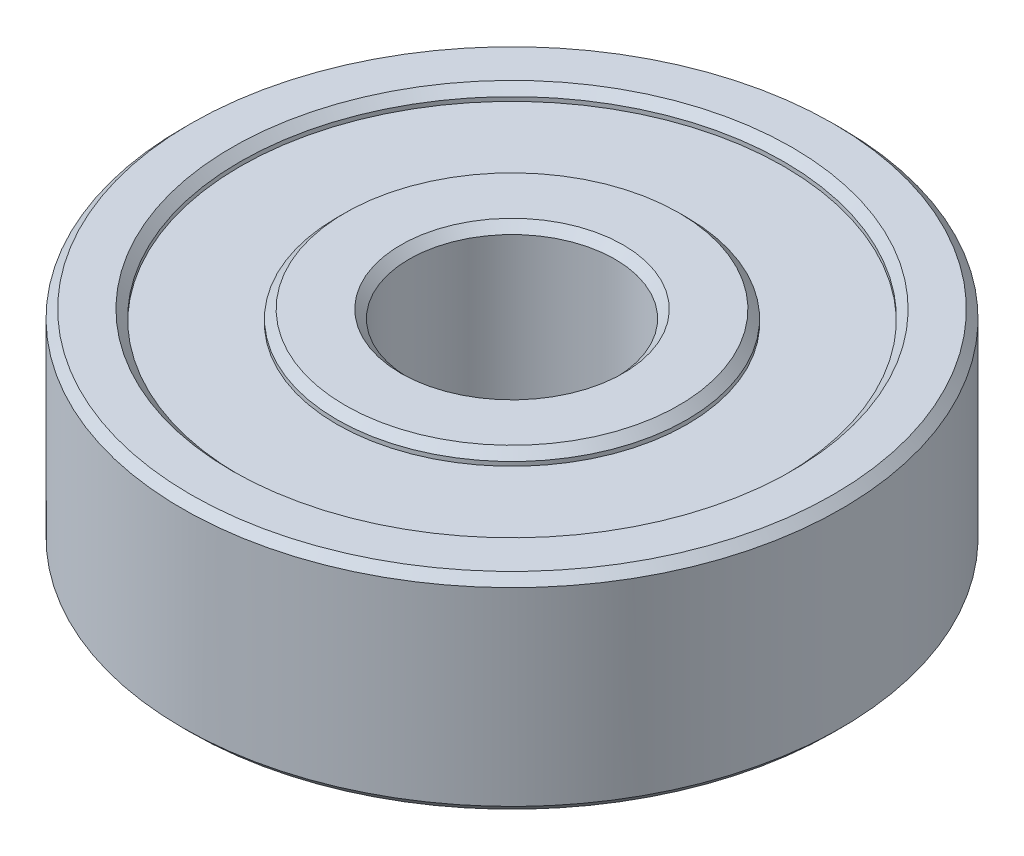
ISO-10303-21;
HEADER;
FILE_DESCRIPTION(('STEP AP214'),'2;1');
FILE_NAME('part.step','',(''),(''),'','','');
FILE_SCHEMA(('AUTOMOTIVE_DESIGN { 1 0 10303 214 1 1 1 1 }'));
ENDSEC;
DATA;
#1=APPLICATION_CONTEXT('core data for automotive mechanical design processes');
#2=APPLICATION_PROTOCOL_DEFINITION('international standard','automotive_design',2000,#1);
#3=PRODUCT_CONTEXT('',#1,'mechanical');
#4=PRODUCT('Part','Part','',(#3));
#5=PRODUCT_RELATED_PRODUCT_CATEGORY('part','',(#4));
#6=PRODUCT_DEFINITION_FORMATION('','',#4);
#7=PRODUCT_DEFINITION_CONTEXT('part definition',#1,'design');
#8=PRODUCT_DEFINITION('design','',#6,#7);
#9=PRODUCT_DEFINITION_SHAPE('','',#8);
#10=(LENGTH_UNIT() NAMED_UNIT(*) SI_UNIT(.MILLI.,.METRE.));
#11=(NAMED_UNIT(*) PLANE_ANGLE_UNIT() SI_UNIT($,.RADIAN.));
#12=(NAMED_UNIT(*) SI_UNIT($,.STERADIAN.) SOLID_ANGLE_UNIT());
#13=UNCERTAINTY_MEASURE_WITH_UNIT(LENGTH_MEASURE(1.E-05),#10,'distance_accuracy_value','');
#14=(GEOMETRIC_REPRESENTATION_CONTEXT(3) GLOBAL_UNCERTAINTY_ASSIGNED_CONTEXT((#13)) GLOBAL_UNIT_ASSIGNED_CONTEXT((#10,
#11,#12)) REPRESENTATION_CONTEXT('',''));
#15=CARTESIAN_POINT('',(0.,0.,0.));
#16=DIRECTION('',(0.,0.,1.));
#17=DIRECTION('',(1.,0.,0.));
#18=AXIS2_PLACEMENT_3D('',#15,#16,#17);
#19=CARTESIAN_POINT('',(0.,4.8,0.));
#20=DIRECTION('',(0.,1.,0.));
#21=DIRECTION('',(0.,0.,-1.));
#22=AXIS2_PLACEMENT_3D('',#19,#20,#21);
#23=CONICAL_SURFACE('',#22,2.5,0.785398163397448);
#24=CARTESIAN_POINT('',(0.,4.8,0.));
#25=DIRECTION('',(0.,1.,0.));
#26=DIRECTION('',(-1.,0.,0.));
#27=AXIS2_PLACEMENT_3D('',#24,#25,#26);
#28=CIRCLE('',#27,2.5);
#29=CARTESIAN_POINT('',(0.,4.8,2.5));
#30=VERTEX_POINT('',#29);
#31=EDGE_CURVE('E151',#30,#30,#28,.T.);
#32=ORIENTED_EDGE('',*,*,#31,.F.);
#33=DIRECTION('',(0.,0.707106781186548,0.707106781186547));
#34=VECTOR('',#33,1.);
#35=CARTESIAN_POINT('',(0.,4.8,2.5));
#36=LINE('',#35,#34);
#37=CARTESIAN_POINT('',(0.,5.,2.7));
#38=VERTEX_POINT('',#37);
#39=EDGE_CURVE('E11',#30,#38,#36,.T.);
#40=ORIENTED_EDGE('',*,*,#39,.T.);
#41=CARTESIAN_POINT('',(0.,5.,0.));
#42=DIRECTION('',(0.,-1.,0.));
#43=DIRECTION('',(0.,0.,-1.));
#44=AXIS2_PLACEMENT_3D('',#41,#42,#43);
#45=CIRCLE('',#44,2.7);
#46=EDGE_CURVE('E28',#38,#38,#45,.T.);
#47=ORIENTED_EDGE('',*,*,#46,.F.);
#48=ORIENTED_EDGE('',*,*,#39,.F.);
#49=EDGE_LOOP('',(#32,#40,#47,#48));
#50=FACE_BOUND('',#49,.T.);
#51=ADVANCED_FACE('F17',(#50),#23,.F.);
#52=CARTESIAN_POINT('',(-4.051,5.,-4.051));
#53=DIRECTION('',(0.,-1.,0.));
#54=DIRECTION('',(0.,0.,-1.));
#55=AXIS2_PLACEMENT_3D('',#52,#53,#54);
#56=PLANE('',#55);
#57=ORIENTED_EDGE('',*,*,#46,.T.);
#58=EDGE_LOOP('',(#57));
#59=FACE_BOUND('',#58,.T.);
#60=CARTESIAN_POINT('',(0.,5.,0.));
#61=DIRECTION('',(0.,-1.,0.));
#62=DIRECTION('',(0.,0.,1.));
#63=AXIS2_PLACEMENT_3D('',#60,#61,#62);
#64=CIRCLE('',#63,4.05);
#65=CARTESIAN_POINT('',(0.,5.,-4.05));
#66=VERTEX_POINT('',#65);
#67=EDGE_CURVE('E169',#66,#66,#64,.T.);
#68=ORIENTED_EDGE('',*,*,#67,.F.);
#69=EDGE_LOOP('',(#68));
#70=FACE_BOUND('',#69,.T.);
#71=ADVANCED_FACE('F569',(#59,#70),#56,.F.);
#72=CARTESIAN_POINT('',(0.,0.2,0.));
#73=DIRECTION('',(0.,-1.,0.));
#74=DIRECTION('',(0.,0.,-1.));
#75=AXIS2_PLACEMENT_3D('',#72,#73,#74);
#76=CYLINDRICAL_SURFACE('',#75,2.5);
#77=CARTESIAN_POINT('',(0.,0.2,0.));
#78=DIRECTION('',(0.,1.,0.));
#79=DIRECTION('',(-1.,0.,0.));
#80=AXIS2_PLACEMENT_3D('',#77,#78,#79);
#81=CIRCLE('',#80,2.5);
#82=CARTESIAN_POINT('',(0.,0.2,-2.5));
#83=VERTEX_POINT('',#82);
#84=CARTESIAN_POINT('',(0.,0.2,2.5));
#85=VERTEX_POINT('',#84);
#86=EDGE_CURVE('E21',#83,#85,#81,.T.);
#87=ORIENTED_EDGE('',*,*,#86,.F.);
#88=CARTESIAN_POINT('',(0.,0.2,0.));
#89=DIRECTION('',(0.,1.,0.));
#90=DIRECTION('',(-1.,0.,0.));
#91=AXIS2_PLACEMENT_3D('',#88,#89,#90);
#92=CIRCLE('',#91,2.5);
#93=EDGE_CURVE('E190',#85,#83,#92,.T.);
#94=ORIENTED_EDGE('',*,*,#93,.F.);
#95=DIRECTION('',(0.,1.,0.));
#96=VECTOR('',#95,1.);
#97=CARTESIAN_POINT('',(0.,0.2,2.5));
#98=LINE('',#97,#96);
#99=EDGE_CURVE('E154',#85,#30,#98,.T.);
#100=ORIENTED_EDGE('',*,*,#99,.T.);
#101=ORIENTED_EDGE('',*,*,#31,.T.);
#102=ORIENTED_EDGE('',*,*,#99,.F.);
#103=EDGE_LOOP('',(#87,#94,#100,#101,#102));
#104=FACE_BOUND('',#103,.T.);
#105=ADVANCED_FACE('F263',(#104),#76,.F.);
#106=CARTESIAN_POINT('',(0.,4.8,0.));
#107=DIRECTION('',(0.,-1.,0.));
#108=DIRECTION('',(0.,0.,1.));
#109=AXIS2_PLACEMENT_3D('',#106,#107,#108);
#110=CONICAL_SURFACE('',#109,4.25,0.785398163397448);
#111=CARTESIAN_POINT('',(0.,4.8,0.));
#112=DIRECTION('',(0.,-1.,0.));
#113=DIRECTION('',(-1.,0.,0.));
#114=AXIS2_PLACEMENT_3D('',#111,#112,#113);
#115=CIRCLE('',#114,4.25);
#116=CARTESIAN_POINT('',(0.,4.8,-4.25));
#117=VERTEX_POINT('',#116);
#118=EDGE_CURVE('E195',#117,#117,#115,.T.);
#119=ORIENTED_EDGE('',*,*,#118,.F.);
#120=DIRECTION('',(0.,0.707106781186548,0.707106781186548));
#121=VECTOR('',#120,1.);
#122=CARTESIAN_POINT('',(0.,4.8,-4.25));
#123=LINE('',#122,#121);
#124=EDGE_CURVE('E202',#117,#66,#123,.T.);
#125=ORIENTED_EDGE('',*,*,#124,.T.);
#126=ORIENTED_EDGE('',*,*,#67,.T.);
#127=ORIENTED_EDGE('',*,*,#124,.F.);
#128=EDGE_LOOP('',(#119,#125,#126,#127));
#129=FACE_BOUND('',#128,.T.);
#130=ADVANCED_FACE('F551',(#129),#110,.T.);
#131=CARTESIAN_POINT('',(0.,0.2,0.));
#132=DIRECTION('',(0.,-1.,0.));
#133=DIRECTION('',(0.,0.,1.));
#134=AXIS2_PLACEMENT_3D('',#131,#132,#133);
#135=CONICAL_SURFACE('',#134,2.5,0.785398163397448);
#136=ORIENTED_EDGE('',*,*,#86,.T.);
#137=ORIENTED_EDGE('',*,*,#93,.T.);
#138=DIRECTION('',(0.,-0.707106781186548,-0.707106781186548));
#139=VECTOR('',#138,1.);
#140=CARTESIAN_POINT('',(0.,0.2,-2.5));
#141=LINE('',#140,#139);
#142=CARTESIAN_POINT('',(0.,0.,-2.7));
#143=VERTEX_POINT('',#142);
#144=EDGE_CURVE('E194',#83,#143,#141,.T.);
#145=ORIENTED_EDGE('',*,*,#144,.T.);
#146=CARTESIAN_POINT('',(0.,0.,0.));
#147=DIRECTION('',(0.,1.,0.));
#148=DIRECTION('',(0.,0.,1.));
#149=AXIS2_PLACEMENT_3D('',#146,#147,#148);
#150=CIRCLE('',#149,2.7);
#151=EDGE_CURVE('E243',#143,#143,#150,.T.);
#152=ORIENTED_EDGE('',*,*,#151,.F.);
#153=ORIENTED_EDGE('',*,*,#144,.F.);
#154=EDGE_LOOP('',(#136,#137,#145,#152,#153));
#155=FACE_BOUND('',#154,.T.);
#156=ADVANCED_FACE('F259',(#155),#135,.F.);
#157=CARTESIAN_POINT('',(0.,4.8,0.));
#158=DIRECTION('',(0.,1.,0.));
#159=DIRECTION('',(0.,0.,1.));
#160=AXIS2_PLACEMENT_3D('',#157,#158,#159);
#161=CYLINDRICAL_SURFACE('',#160,4.25);
#162=CARTESIAN_POINT('',(0.,4.7,0.));
#163=DIRECTION('',(0.,-1.,0.));
#164=DIRECTION('',(0.,0.,1.));
#165=AXIS2_PLACEMENT_3D('',#162,#163,#164);
#166=CIRCLE('',#165,4.25);
#167=CARTESIAN_POINT('',(0.,4.7,-4.25));
#168=VERTEX_POINT('',#167);
#169=EDGE_CURVE('E174',#168,#168,#166,.T.);
#170=ORIENTED_EDGE('',*,*,#169,.F.);
#171=DIRECTION('',(0.,1.,0.));
#172=VECTOR('',#171,1.);
#173=CARTESIAN_POINT('',(0.,4.8,-4.25));
#174=LINE('',#173,#172);
#175=EDGE_CURVE('E198',#168,#117,#174,.T.);
#176=ORIENTED_EDGE('',*,*,#175,.T.);
#177=ORIENTED_EDGE('',*,*,#118,.T.);
#178=ORIENTED_EDGE('',*,*,#175,.F.);
#179=EDGE_LOOP('',(#170,#176,#177,#178));
#180=FACE_BOUND('',#179,.T.);
#181=ADVANCED_FACE('F533',(#180),#161,.T.);
#182=CARTESIAN_POINT('',(4.051,0.,-4.051));
#183=DIRECTION('',(0.,1.,0.));
#184=DIRECTION('',(1.,0.,0.));
#185=AXIS2_PLACEMENT_3D('',#182,#183,#184);
#186=PLANE('',#185);
#187=ORIENTED_EDGE('',*,*,#151,.T.);
#188=EDGE_LOOP('',(#187));
#189=FACE_BOUND('',#188,.T.);
#190=CARTESIAN_POINT('',(0.,0.,0.));
#191=DIRECTION('',(0.,1.,0.));
#192=DIRECTION('',(0.,0.,-1.));
#193=AXIS2_PLACEMENT_3D('',#190,#191,#192);
#194=CIRCLE('',#193,4.05);
#195=CARTESIAN_POINT('',(0.,0.,4.05));
#196=VERTEX_POINT('',#195);
#197=EDGE_CURVE('E170',#196,#196,#194,.T.);
#198=ORIENTED_EDGE('',*,*,#197,.F.);
#199=EDGE_LOOP('',(#198));
#200=FACE_BOUND('',#199,.T.);
#201=ADVANCED_FACE('F255',(#189,#200),#186,.F.);
#202=CARTESIAN_POINT('',(-6.601,4.7,-6.601));
#203=DIRECTION('',(0.,-1.,0.));
#204=DIRECTION('',(0.,0.,-1.));
#205=AXIS2_PLACEMENT_3D('',#202,#203,#204);
#206=PLANE('',#205);
#207=ORIENTED_EDGE('',*,*,#169,.T.);
#208=EDGE_LOOP('',(#207));
#209=FACE_BOUND('',#208,.T.);
#210=CARTESIAN_POINT('',(0.,4.7,0.));
#211=DIRECTION('',(0.,-1.,0.));
#212=DIRECTION('',(0.,0.,-1.));
#213=AXIS2_PLACEMENT_3D('',#210,#211,#212);
#214=CIRCLE('',#213,6.6);
#215=CARTESIAN_POINT('',(0.,4.7,6.6));
#216=VERTEX_POINT('',#215);
#217=EDGE_CURVE('E179',#216,#216,#214,.T.);
#218=ORIENTED_EDGE('',*,*,#217,.F.);
#219=EDGE_LOOP('',(#218));
#220=FACE_BOUND('',#219,.T.);
#221=ADVANCED_FACE('F19',(#209,#220),#206,.F.);
#222=CARTESIAN_POINT('',(0.,0.2,0.));
#223=DIRECTION('',(0.,1.,0.));
#224=DIRECTION('',(0.,0.,-1.));
#225=AXIS2_PLACEMENT_3D('',#222,#223,#224);
#226=CONICAL_SURFACE('',#225,4.25,0.78539816339745);
#227=CARTESIAN_POINT('',(0.,0.2,0.));
#228=DIRECTION('',(0.,1.,0.));
#229=DIRECTION('',(-1.,0.,0.));
#230=AXIS2_PLACEMENT_3D('',#227,#228,#229);
#231=CIRCLE('',#230,4.25);
#232=CARTESIAN_POINT('',(0.,0.2,-4.25));
#233=VERTEX_POINT('',#232);
#234=CARTESIAN_POINT('',(0.,0.2,4.25));
#235=VERTEX_POINT('',#234);
#236=EDGE_CURVE('E185',#233,#235,#231,.T.);
#237=ORIENTED_EDGE('',*,*,#236,.F.);
#238=CARTESIAN_POINT('',(0.,0.2,0.));
#239=DIRECTION('',(0.,1.,0.));
#240=DIRECTION('',(-1.,0.,0.));
#241=AXIS2_PLACEMENT_3D('',#238,#239,#240);
#242=CIRCLE('',#241,4.25);
#243=EDGE_CURVE('E189',#235,#233,#242,.T.);
#244=ORIENTED_EDGE('',*,*,#243,.F.);
#245=DIRECTION('',(0.,-0.707106781186547,-0.707106781186549));
#246=VECTOR('',#245,1.);
#247=CARTESIAN_POINT('',(0.,0.2,4.25));
#248=LINE('',#247,#246);
#249=EDGE_CURVE('E175',#235,#196,#248,.T.);
#250=ORIENTED_EDGE('',*,*,#249,.T.);
#251=ORIENTED_EDGE('',*,*,#197,.T.);
#252=ORIENTED_EDGE('',*,*,#249,.F.);
#253=EDGE_LOOP('',(#237,#244,#250,#251,#252));
#254=FACE_BOUND('',#253,.T.);
#255=ADVANCED_FACE('F504',(#254),#226,.T.);
#256=CARTESIAN_POINT('',(0.,4.7,0.));
#257=DIRECTION('',(0.,-1.,0.));
#258=DIRECTION('',(0.,0.,-1.));
#259=AXIS2_PLACEMENT_3D('',#256,#257,#258);
#260=CYLINDRICAL_SURFACE('',#259,6.6);
#261=ORIENTED_EDGE('',*,*,#217,.T.);
#262=DIRECTION('',(0.,1.,0.));
#263=VECTOR('',#262,1.);
#264=CARTESIAN_POINT('',(0.,4.7,6.6));
#265=LINE('',#264,#263);
#266=CARTESIAN_POINT('',(0.,4.8,6.6));
#267=VERTEX_POINT('',#266);
#268=EDGE_CURVE('E183',#216,#267,#265,.T.);
#269=ORIENTED_EDGE('',*,*,#268,.T.);
#270=CARTESIAN_POINT('',(0.,4.8,0.));
#271=DIRECTION('',(0.,-1.,0.));
#272=DIRECTION('',(-1.,0.,0.));
#273=AXIS2_PLACEMENT_3D('',#270,#271,#272);
#274=CIRCLE('',#273,6.6);
#275=EDGE_CURVE('E156',#267,#267,#274,.T.);
#276=ORIENTED_EDGE('',*,*,#275,.F.);
#277=ORIENTED_EDGE('',*,*,#268,.F.);
#278=EDGE_LOOP('',(#261,#269,#276,#277));
#279=FACE_BOUND('',#278,.T.);
#280=ADVANCED_FACE('F493',(#279),#260,.F.);
#281=CARTESIAN_POINT('',(0.,0.3,0.));
#282=DIRECTION('',(0.,1.,0.));
#283=DIRECTION('',(0.,0.,1.));
#284=AXIS2_PLACEMENT_3D('',#281,#282,#283);
#285=CYLINDRICAL_SURFACE('',#284,4.25);
#286=ORIENTED_EDGE('',*,*,#236,.T.);
#287=ORIENTED_EDGE('',*,*,#243,.T.);
#288=DIRECTION('',(0.,1.,0.));
#289=VECTOR('',#288,1.);
#290=CARTESIAN_POINT('',(0.,0.3,-4.25));
#291=LINE('',#290,#289);
#292=CARTESIAN_POINT('',(0.,0.3,-4.25));
#293=VERTEX_POINT('',#292);
#294=EDGE_CURVE('E184',#233,#293,#291,.T.);
#295=ORIENTED_EDGE('',*,*,#294,.T.);
#296=CARTESIAN_POINT('',(0.,0.3,0.));
#297=DIRECTION('',(0.,1.,0.));
#298=DIRECTION('',(0.,0.,1.));
#299=AXIS2_PLACEMENT_3D('',#296,#297,#298);
#300=CIRCLE('',#299,4.25);
#301=EDGE_CURVE('E149',#293,#293,#300,.T.);
#302=ORIENTED_EDGE('',*,*,#301,.F.);
#303=ORIENTED_EDGE('',*,*,#294,.F.);
#304=EDGE_LOOP('',(#286,#287,#295,#302,#303));
#305=FACE_BOUND('',#304,.T.);
#306=ADVANCED_FACE('F482',(#305),#285,.T.);
#307=CARTESIAN_POINT('',(0.,4.8,0.));
#308=DIRECTION('',(0.,1.,0.));
#309=DIRECTION('',(0.,0.,-1.));
#310=AXIS2_PLACEMENT_3D('',#307,#308,#309);
#311=CONICAL_SURFACE('',#310,6.6,0.785398163397446);
#312=ORIENTED_EDGE('',*,*,#275,.T.);
#313=DIRECTION('',(0.,0.707106781186549,0.707106781186546));
#314=VECTOR('',#313,1.);
#315=CARTESIAN_POINT('',(0.,4.8,6.6));
#316=LINE('',#315,#314);
#317=CARTESIAN_POINT('',(0.,5.,6.8));
#318=VERTEX_POINT('',#317);
#319=EDGE_CURVE('E160',#267,#318,#316,.T.);
#320=ORIENTED_EDGE('',*,*,#319,.T.);
#321=CARTESIAN_POINT('',(0.,5.,0.));
#322=DIRECTION('',(0.,-1.,0.));
#323=DIRECTION('',(0.,0.,-1.));
#324=AXIS2_PLACEMENT_3D('',#321,#322,#323);
#325=CIRCLE('',#324,6.8);
#326=EDGE_CURVE('E145',#318,#318,#325,.T.);
#327=ORIENTED_EDGE('',*,*,#326,.F.);
#328=ORIENTED_EDGE('',*,*,#319,.F.);
#329=EDGE_LOOP('',(#312,#320,#327,#328));
#330=FACE_BOUND('',#329,.T.);
#331=ADVANCED_FACE('F472',(#330),#311,.F.);
#332=CARTESIAN_POINT('',(6.601,0.3,-6.601));
#333=DIRECTION('',(0.,1.,0.));
#334=DIRECTION('',(1.,0.,0.));
#335=AXIS2_PLACEMENT_3D('',#332,#333,#334);
#336=PLANE('',#335);
#337=ORIENTED_EDGE('',*,*,#301,.T.);
#338=EDGE_LOOP('',(#337));
#339=FACE_BOUND('',#338,.T.);
#340=CARTESIAN_POINT('',(0.,0.3,0.));
#341=DIRECTION('',(0.,1.,0.));
#342=DIRECTION('',(0.,0.,-1.));
#343=AXIS2_PLACEMENT_3D('',#340,#341,#342);
#344=CIRCLE('',#343,6.6);
#345=CARTESIAN_POINT('',(0.,0.3,6.6));
#346=VERTEX_POINT('',#345);
#347=EDGE_CURVE('E150',#346,#346,#344,.T.);
#348=ORIENTED_EDGE('',*,*,#347,.F.);
#349=EDGE_LOOP('',(#348));
#350=FACE_BOUND('',#349,.T.);
#351=ADVANCED_FACE('F462',(#339,#350),#336,.F.);
#352=CARTESIAN_POINT('',(-7.801,5.,-7.801));
#353=DIRECTION('',(0.,-1.,0.));
#354=DIRECTION('',(0.,0.,-1.));
#355=AXIS2_PLACEMENT_3D('',#352,#353,#354);
#356=PLANE('',#355);
#357=ORIENTED_EDGE('',*,*,#326,.T.);
#358=EDGE_LOOP('',(#357));
#359=FACE_BOUND('',#358,.T.);
#360=CARTESIAN_POINT('',(0.,5.,0.));
#361=DIRECTION('',(0.,-1.,0.));
#362=DIRECTION('',(0.,0.,1.));
#363=AXIS2_PLACEMENT_3D('',#360,#361,#362);
#364=CIRCLE('',#363,7.8);
#365=CARTESIAN_POINT('',(0.,5.,-7.8));
#366=VERTEX_POINT('',#365);
#367=EDGE_CURVE('E218',#366,#366,#364,.T.);
#368=ORIENTED_EDGE('',*,*,#367,.F.);
#369=EDGE_LOOP('',(#368));
#370=FACE_BOUND('',#369,.T.);
#371=ADVANCED_FACE('F451',(#359,#370),#356,.F.);
#372=CARTESIAN_POINT('',(0.,0.2,0.));
#373=DIRECTION('',(0.,-1.,0.));
#374=DIRECTION('',(0.,0.,-1.));
#375=AXIS2_PLACEMENT_3D('',#372,#373,#374);
#376=CYLINDRICAL_SURFACE('',#375,6.6);
#377=CARTESIAN_POINT('',(0.,0.2,0.));
#378=DIRECTION('',(0.,1.,0.));
#379=DIRECTION('',(-1.,0.,0.));
#380=AXIS2_PLACEMENT_3D('',#377,#378,#379);
#381=CIRCLE('',#380,6.6);
#382=CARTESIAN_POINT('',(0.,0.2,-6.6));
#383=VERTEX_POINT('',#382);
#384=CARTESIAN_POINT('',(0.,0.2,6.6));
#385=VERTEX_POINT('',#384);
#386=EDGE_CURVE('E143',#383,#385,#381,.T.);
#387=ORIENTED_EDGE('',*,*,#386,.F.);
#388=CARTESIAN_POINT('',(0.,0.2,0.));
#389=DIRECTION('',(0.,1.,0.));
#390=DIRECTION('',(-1.,0.,0.));
#391=AXIS2_PLACEMENT_3D('',#388,#389,#390);
#392=CIRCLE('',#391,6.6);
#393=EDGE_CURVE('E161',#385,#383,#392,.T.);
#394=ORIENTED_EDGE('',*,*,#393,.F.);
#395=DIRECTION('',(0.,1.,0.));
#396=VECTOR('',#395,1.);
#397=CARTESIAN_POINT('',(0.,0.2,6.6));
#398=LINE('',#397,#396);
#399=EDGE_CURVE('E205',#385,#346,#398,.T.);
#400=ORIENTED_EDGE('',*,*,#399,.T.);
#401=ORIENTED_EDGE('',*,*,#347,.T.);
#402=ORIENTED_EDGE('',*,*,#399,.F.);
#403=EDGE_LOOP('',(#387,#394,#400,#401,#402));
#404=FACE_BOUND('',#403,.T.);
#405=ADVANCED_FACE('F439',(#404),#376,.F.);
#406=CARTESIAN_POINT('',(0.,4.8,0.));
#407=DIRECTION('',(0.,-1.,0.));
#408=DIRECTION('',(0.,0.,1.));
#409=AXIS2_PLACEMENT_3D('',#406,#407,#408);
#410=CONICAL_SURFACE('',#409,8.,0.785398163397448);
#411=CARTESIAN_POINT('',(0.,4.8,0.));
#412=DIRECTION('',(0.,-1.,0.));
#413=DIRECTION('',(-1.,0.,0.));
#414=AXIS2_PLACEMENT_3D('',#411,#412,#413);
#415=CIRCLE('',#414,8.);
#416=CARTESIAN_POINT('',(0.,4.8,-8.));
#417=VERTEX_POINT('',#416);
#418=EDGE_CURVE('E176',#417,#417,#415,.T.);
#419=ORIENTED_EDGE('',*,*,#418,.F.);
#420=DIRECTION('',(0.,0.707106781186548,0.707106781186548));
#421=VECTOR('',#420,1.);
#422=CARTESIAN_POINT('',(0.,4.8,-8.));
#423=LINE('',#422,#421);
#424=EDGE_CURVE('E221',#417,#366,#423,.T.);
#425=ORIENTED_EDGE('',*,*,#424,.T.);
#426=ORIENTED_EDGE('',*,*,#367,.T.);
#427=ORIENTED_EDGE('',*,*,#424,.F.);
#428=EDGE_LOOP('',(#419,#425,#426,#427));
#429=FACE_BOUND('',#428,.T.);
#430=ADVANCED_FACE('F426',(#429),#410,.T.);
#431=CARTESIAN_POINT('',(0.,0.2,0.));
#432=DIRECTION('',(0.,-1.,0.));
#433=DIRECTION('',(0.,0.,1.));
#434=AXIS2_PLACEMENT_3D('',#431,#432,#433);
#435=CONICAL_SURFACE('',#434,6.6,0.785398163397448);
#436=ORIENTED_EDGE('',*,*,#386,.T.);
#437=ORIENTED_EDGE('',*,*,#393,.T.);
#438=DIRECTION('',(0.,-0.707106781186548,-0.707106781186547));
#439=VECTOR('',#438,1.);
#440=CARTESIAN_POINT('',(0.,0.2,-6.6));
#441=LINE('',#440,#439);
#442=CARTESIAN_POINT('',(0.,0.,-6.8));
#443=VERTEX_POINT('',#442);
#444=EDGE_CURVE('E165',#383,#443,#441,.T.);
#445=ORIENTED_EDGE('',*,*,#444,.T.);
#446=CARTESIAN_POINT('',(0.,0.,0.));
#447=DIRECTION('',(0.,1.,0.));
#448=DIRECTION('',(0.,0.,1.));
#449=AXIS2_PLACEMENT_3D('',#446,#447,#448);
#450=CIRCLE('',#449,6.8);
#451=EDGE_CURVE('E227',#443,#443,#450,.T.);
#452=ORIENTED_EDGE('',*,*,#451,.F.);
#453=ORIENTED_EDGE('',*,*,#444,.F.);
#454=EDGE_LOOP('',(#436,#437,#445,#452,#453));
#455=FACE_BOUND('',#454,.T.);
#456=ADVANCED_FACE('F415',(#455),#435,.F.);
#457=CARTESIAN_POINT('',(0.,4.8,0.));
#458=DIRECTION('',(0.,1.,0.));
#459=DIRECTION('',(0.,0.,1.));
#460=AXIS2_PLACEMENT_3D('',#457,#458,#459);
#461=CYLINDRICAL_SURFACE('',#460,8.);
#462=CARTESIAN_POINT('',(0.,0.2,0.));
#463=DIRECTION('',(0.,-1.,0.));
#464=DIRECTION('',(-1.,0.,0.));
#465=AXIS2_PLACEMENT_3D('',#462,#463,#464);
#466=CIRCLE('',#465,8.);
#467=CARTESIAN_POINT('',(0.,0.2,8.));
#468=VERTEX_POINT('',#467);
#469=CARTESIAN_POINT('',(0.,0.2,-8.));
#470=VERTEX_POINT('',#469);
#471=EDGE_CURVE('E122',#468,#470,#466,.T.);
#472=ORIENTED_EDGE('',*,*,#471,.F.);
#473=CARTESIAN_POINT('',(0.,0.2,0.));
#474=DIRECTION('',(0.,-1.,0.));
#475=DIRECTION('',(-1.,0.,0.));
#476=AXIS2_PLACEMENT_3D('',#473,#474,#475);
#477=CIRCLE('',#476,8.);
#478=EDGE_CURVE('E126',#470,#468,#477,.T.);
#479=ORIENTED_EDGE('',*,*,#478,.F.);
#480=DIRECTION('',(0.,1.,0.));
#481=VECTOR('',#480,1.);
#482=CARTESIAN_POINT('',(0.,4.8,-8.));
#483=LINE('',#482,#481);
#484=EDGE_CURVE('E135',#470,#417,#483,.T.);
#485=ORIENTED_EDGE('',*,*,#484,.T.);
#486=ORIENTED_EDGE('',*,*,#418,.T.);
#487=ORIENTED_EDGE('',*,*,#484,.F.);
#488=EDGE_LOOP('',(#472,#479,#485,#486,#487));
#489=FACE_BOUND('',#488,.T.);
#490=ADVANCED_FACE('F133',(#489),#461,.T.);
#491=CARTESIAN_POINT('',(7.801,0.,-7.801));
#492=DIRECTION('',(0.,1.,0.));
#493=DIRECTION('',(1.,0.,0.));
#494=AXIS2_PLACEMENT_3D('',#491,#492,#493);
#495=PLANE('',#494);
#496=ORIENTED_EDGE('',*,*,#451,.T.);
#497=EDGE_LOOP('',(#496));
#498=FACE_BOUND('',#497,.T.);
#499=CARTESIAN_POINT('',(0.,0.,0.));
#500=DIRECTION('',(0.,1.,0.));
#501=DIRECTION('',(0.,0.,-1.));
#502=AXIS2_PLACEMENT_3D('',#499,#500,#501);
#503=CIRCLE('',#502,7.8);
#504=CARTESIAN_POINT('',(0.,0.,7.8));
#505=VERTEX_POINT('',#504);
#506=EDGE_CURVE('E124',#505,#505,#503,.T.);
#507=ORIENTED_EDGE('',*,*,#506,.F.);
#508=EDGE_LOOP('',(#507));
#509=FACE_BOUND('',#508,.T.);
#510=ADVANCED_FACE('F390',(#498,#509),#495,.F.);
#511=CARTESIAN_POINT('',(0.,0.2,0.));
#512=DIRECTION('',(0.,1.,0.));
#513=DIRECTION('',(0.,0.,-1.));
#514=AXIS2_PLACEMENT_3D('',#511,#512,#513);
#515=CONICAL_SURFACE('',#514,8.,0.78539816339745);
#516=ORIENTED_EDGE('',*,*,#471,.T.);
#517=ORIENTED_EDGE('',*,*,#478,.T.);
#518=DIRECTION('',(0.,-0.707106781186547,-0.707106781186549));
#519=VECTOR('',#518,1.);
#520=CARTESIAN_POINT('',(0.,0.2,8.));
#521=LINE('',#520,#519);
#522=EDGE_CURVE('E118',#468,#505,#521,.T.);
#523=ORIENTED_EDGE('',*,*,#522,.T.);
#524=ORIENTED_EDGE('',*,*,#506,.T.);
#525=ORIENTED_EDGE('',*,*,#522,.F.);
#526=EDGE_LOOP('',(#516,#517,#523,#524,#525));
#527=FACE_BOUND('',#526,.T.);
#528=ADVANCED_FACE('F120',(#527),#515,.T.);
#529=CLOSED_SHELL('',(#51,#71,#105,#130,#156,#181,#201,#221,#255,#280,#306,#331,#351,#371,#405,
#430,#456,#490,#510,#528));
#530=MANIFOLD_SOLID_BREP('B1',#529);
#531=ADVANCED_BREP_SHAPE_REPRESENTATION('',(#18,#530),#14);
#532=SHAPE_DEFINITION_REPRESENTATION(#9,#531);
ENDSEC;
END-ISO-10303-21;
